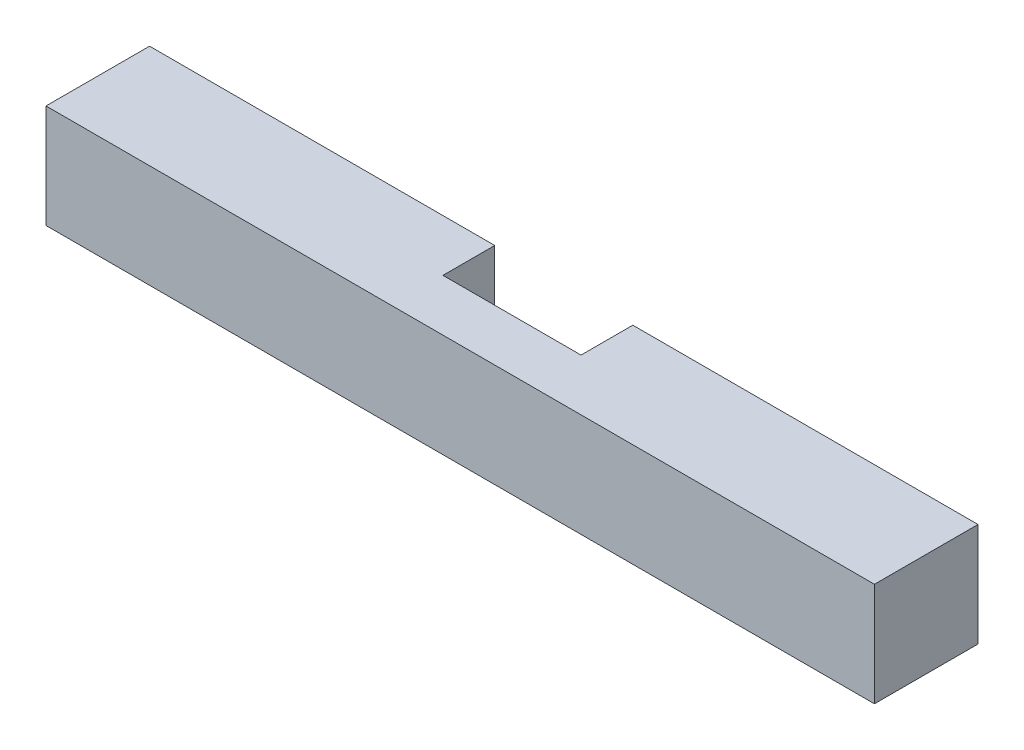
ISO-10303-21;
HEADER;
FILE_DESCRIPTION(('STEP AP214'),'2;1');
FILE_NAME('part.step','',(''),(''),'','','');
FILE_SCHEMA(('AUTOMOTIVE_DESIGN { 1 0 10303 214 1 1 1 1 }'));
ENDSEC;
DATA;
#1=APPLICATION_CONTEXT('core data for automotive mechanical design processes');
#2=APPLICATION_PROTOCOL_DEFINITION('international standard','automotive_design',2000,#1);
#3=PRODUCT_CONTEXT('',#1,'mechanical');
#4=PRODUCT('Part','Part','',(#3));
#5=PRODUCT_RELATED_PRODUCT_CATEGORY('part','',(#4));
#6=PRODUCT_DEFINITION_FORMATION('','',#4);
#7=PRODUCT_DEFINITION_CONTEXT('part definition',#1,'design');
#8=PRODUCT_DEFINITION('design','',#6,#7);
#9=PRODUCT_DEFINITION_SHAPE('','',#8);
#10=(LENGTH_UNIT() NAMED_UNIT(*) SI_UNIT(.MILLI.,.METRE.));
#11=(NAMED_UNIT(*) PLANE_ANGLE_UNIT() SI_UNIT($,.RADIAN.));
#12=(NAMED_UNIT(*) SI_UNIT($,.STERADIAN.) SOLID_ANGLE_UNIT());
#13=UNCERTAINTY_MEASURE_WITH_UNIT(LENGTH_MEASURE(1.E-05),#10,'distance_accuracy_value','');
#14=(GEOMETRIC_REPRESENTATION_CONTEXT(3) GLOBAL_UNCERTAINTY_ASSIGNED_CONTEXT((#13)) GLOBAL_UNIT_ASSIGNED_CONTEXT((#10,
#11,#12)) REPRESENTATION_CONTEXT('',''));
#15=CARTESIAN_POINT('',(0.,0.,0.));
#16=DIRECTION('',(0.,0.,1.));
#17=DIRECTION('',(1.,0.,0.));
#18=AXIS2_PLACEMENT_3D('',#15,#16,#17);
#19=CARTESIAN_POINT('',(0.,6.35,-6.35));
#20=DIRECTION('',(1.,0.,0.));
#21=DIRECTION('',(0.,0.,-1.));
#22=AXIS2_PLACEMENT_3D('',#19,#20,#21);
#23=PLANE('',#22);
#24=DIRECTION('',(0.,0.,1.));
#25=VECTOR('',#24,1.);
#26=CARTESIAN_POINT('',(0.,0.,-6.35));
#27=LINE('',#26,#25);
#28=CARTESIAN_POINT('',(0.,0.,-6.35));
#29=VERTEX_POINT('',#28);
#30=CARTESIAN_POINT('',(0.,0.,0.));
#31=VERTEX_POINT('',#30);
#32=EDGE_CURVE('E129',#29,#31,#27,.T.);
#33=ORIENTED_EDGE('',*,*,#32,.T.);
#34=DIRECTION('',(0.,-1.,0.));
#35=VECTOR('',#34,1.);
#36=CARTESIAN_POINT('',(0.,6.35,0.));
#37=LINE('',#36,#35);
#38=CARTESIAN_POINT('',(0.,6.35,0.));
#39=VERTEX_POINT('',#38);
#40=EDGE_CURVE('E11',#39,#31,#37,.T.);
#41=ORIENTED_EDGE('',*,*,#40,.F.);
#42=DIRECTION('',(0.,0.,1.));
#43=VECTOR('',#42,1.);
#44=CARTESIAN_POINT('',(0.,6.35,-6.35));
#45=LINE('',#44,#43);
#46=CARTESIAN_POINT('',(0.,6.35,-6.35));
#47=VERTEX_POINT('',#46);
#48=EDGE_CURVE('E143',#47,#39,#45,.T.);
#49=ORIENTED_EDGE('',*,*,#48,.F.);
#50=DIRECTION('',(0.,-1.,0.));
#51=VECTOR('',#50,1.);
#52=CARTESIAN_POINT('',(0.,6.35,-6.35));
#53=LINE('',#52,#51);
#54=EDGE_CURVE('E125',#47,#29,#53,.T.);
#55=ORIENTED_EDGE('',*,*,#54,.T.);
#56=EDGE_LOOP('',(#33,#41,#49,#55));
#57=FACE_BOUND('',#56,.T.);
#58=ADVANCED_FACE('F33',(#57),#23,.F.);
#59=CARTESIAN_POINT('',(0.,6.35,0.));
#60=DIRECTION('',(0.,0.,-1.));
#61=DIRECTION('',(-1.,0.,0.));
#62=AXIS2_PLACEMENT_3D('',#59,#60,#61);
#63=PLANE('',#62);
#64=DIRECTION('',(1.,0.,0.));
#65=VECTOR('',#64,1.);
#66=CARTESIAN_POINT('',(0.,0.,0.));
#67=LINE('',#66,#65);
#68=CARTESIAN_POINT('',(50.8,0.,0.));
#69=VERTEX_POINT('',#68);
#70=EDGE_CURVE('E132',#31,#69,#67,.T.);
#71=ORIENTED_EDGE('',*,*,#70,.T.);
#72=DIRECTION('',(0.,-1.,0.));
#73=VECTOR('',#72,1.);
#74=CARTESIAN_POINT('',(50.8,6.35,0.));
#75=LINE('',#74,#73);
#76=CARTESIAN_POINT('',(50.8,6.35,0.));
#77=VERTEX_POINT('',#76);
#78=EDGE_CURVE('E41',#77,#69,#75,.T.);
#79=ORIENTED_EDGE('',*,*,#78,.F.);
#80=DIRECTION('',(1.,0.,0.));
#81=VECTOR('',#80,1.);
#82=CARTESIAN_POINT('',(0.,6.35,0.));
#83=LINE('',#82,#81);
#84=EDGE_CURVE('E92',#39,#77,#83,.T.);
#85=ORIENTED_EDGE('',*,*,#84,.F.);
#86=ORIENTED_EDGE('',*,*,#40,.T.);
#87=EDGE_LOOP('',(#71,#79,#85,#86));
#88=FACE_BOUND('',#87,.T.);
#89=ADVANCED_FACE('F178',(#88),#63,.F.);
#90=CARTESIAN_POINT('',(50.8,6.35,0.));
#91=DIRECTION('',(-1.,0.,0.));
#92=DIRECTION('',(0.,0.,1.));
#93=AXIS2_PLACEMENT_3D('',#90,#91,#92);
#94=PLANE('',#93);
#95=DIRECTION('',(0.,0.,-1.));
#96=VECTOR('',#95,1.);
#97=CARTESIAN_POINT('',(50.8,0.,0.));
#98=LINE('',#97,#96);
#99=CARTESIAN_POINT('',(50.8,0.,-6.35));
#100=VERTEX_POINT('',#99);
#101=EDGE_CURVE('E134',#69,#100,#98,.T.);
#102=ORIENTED_EDGE('',*,*,#101,.T.);
#103=DIRECTION('',(0.,-1.,0.));
#104=VECTOR('',#103,1.);
#105=CARTESIAN_POINT('',(50.8,6.35,-6.35));
#106=LINE('',#105,#104);
#107=CARTESIAN_POINT('',(50.8,6.35,-6.35));
#108=VERTEX_POINT('',#107);
#109=EDGE_CURVE('E150',#108,#100,#106,.T.);
#110=ORIENTED_EDGE('',*,*,#109,.F.);
#111=DIRECTION('',(0.,0.,-1.));
#112=VECTOR('',#111,1.);
#113=CARTESIAN_POINT('',(50.8,6.35,0.));
#114=LINE('',#113,#112);
#115=EDGE_CURVE('E158',#77,#108,#114,.T.);
#116=ORIENTED_EDGE('',*,*,#115,.F.);
#117=ORIENTED_EDGE('',*,*,#78,.T.);
#118=EDGE_LOOP('',(#102,#110,#116,#117));
#119=FACE_BOUND('',#118,.T.);
#120=ADVANCED_FACE('F156',(#119),#94,.F.);
#121=CARTESIAN_POINT('',(50.8,6.35,-6.35));
#122=DIRECTION('',(0.,0.,1.));
#123=DIRECTION('',(1.,0.,0.));
#124=AXIS2_PLACEMENT_3D('',#121,#122,#123);
#125=PLANE('',#124);
#126=DIRECTION('',(-1.,0.,0.));
#127=VECTOR('',#126,1.);
#128=CARTESIAN_POINT('',(50.8,0.,-6.35));
#129=LINE('',#128,#127);
#130=CARTESIAN_POINT('',(29.6333333333333,0.,-6.35));
#131=VERTEX_POINT('',#130);
#132=EDGE_CURVE('E136',#100,#131,#129,.T.);
#133=ORIENTED_EDGE('',*,*,#132,.T.);
#134=DIRECTION('',(0.,-1.,0.));
#135=VECTOR('',#134,1.);
#136=CARTESIAN_POINT('',(29.6333333333333,6.35,-6.35));
#137=LINE('',#136,#135);
#138=CARTESIAN_POINT('',(29.6333333333333,6.35,-6.35));
#139=VERTEX_POINT('',#138);
#140=EDGE_CURVE('E147',#139,#131,#137,.T.);
#141=ORIENTED_EDGE('',*,*,#140,.F.);
#142=DIRECTION('',(-1.,0.,0.));
#143=VECTOR('',#142,1.);
#144=CARTESIAN_POINT('',(50.8,6.35,-6.35));
#145=LINE('',#144,#143);
#146=EDGE_CURVE('E170',#108,#139,#145,.T.);
#147=ORIENTED_EDGE('',*,*,#146,.F.);
#148=ORIENTED_EDGE('',*,*,#109,.T.);
#149=EDGE_LOOP('',(#133,#141,#147,#148));
#150=FACE_BOUND('',#149,.T.);
#151=ADVANCED_FACE('F166',(#150),#125,.F.);
#152=CARTESIAN_POINT('',(29.6333333333333,6.35,-6.35));
#153=DIRECTION('',(1.,0.,0.));
#154=DIRECTION('',(0.,0.,-1.));
#155=AXIS2_PLACEMENT_3D('',#152,#153,#154);
#156=PLANE('',#155);
#157=DIRECTION('',(0.,0.,1.));
#158=VECTOR('',#157,1.);
#159=CARTESIAN_POINT('',(29.6333333333333,0.,-6.35));
#160=LINE('',#159,#158);
#161=CARTESIAN_POINT('',(29.6333333333333,0.,-3.175));
#162=VERTEX_POINT('',#161);
#163=EDGE_CURVE('E138',#131,#162,#160,.T.);
#164=ORIENTED_EDGE('',*,*,#163,.T.);
#165=DIRECTION('',(0.,-1.,0.));
#166=VECTOR('',#165,1.);
#167=CARTESIAN_POINT('',(29.6333333333333,6.35,-3.175));
#168=LINE('',#167,#166);
#169=CARTESIAN_POINT('',(29.6333333333333,6.35,-3.175));
#170=VERTEX_POINT('',#169);
#171=EDGE_CURVE('E120',#170,#162,#168,.T.);
#172=ORIENTED_EDGE('',*,*,#171,.F.);
#173=DIRECTION('',(0.,0.,1.));
#174=VECTOR('',#173,1.);
#175=CARTESIAN_POINT('',(29.6333333333333,6.35,-6.35));
#176=LINE('',#175,#174);
#177=EDGE_CURVE('E111',#139,#170,#176,.T.);
#178=ORIENTED_EDGE('',*,*,#177,.F.);
#179=ORIENTED_EDGE('',*,*,#140,.T.);
#180=EDGE_LOOP('',(#164,#172,#178,#179));
#181=FACE_BOUND('',#180,.T.);
#182=ADVANCED_FACE('F169',(#181),#156,.F.);
#183=CARTESIAN_POINT('',(29.6333333333333,6.35,-3.175));
#184=DIRECTION('',(0.,0.,1.));
#185=DIRECTION('',(1.,0.,0.));
#186=AXIS2_PLACEMENT_3D('',#183,#184,#185);
#187=PLANE('',#186);
#188=DIRECTION('',(-1.,0.,0.));
#189=VECTOR('',#188,1.);
#190=CARTESIAN_POINT('',(29.6333333333333,0.,-3.175));
#191=LINE('',#190,#189);
#192=CARTESIAN_POINT('',(21.1666666666667,0.,-3.175));
#193=VERTEX_POINT('',#192);
#194=EDGE_CURVE('E119',#162,#193,#191,.T.);
#195=ORIENTED_EDGE('',*,*,#194,.T.);
#196=DIRECTION('',(0.,-1.,0.));
#197=VECTOR('',#196,1.);
#198=CARTESIAN_POINT('',(21.1666666666667,6.35,-3.175));
#199=LINE('',#198,#197);
#200=CARTESIAN_POINT('',(21.1666666666667,6.35,-3.175));
#201=VERTEX_POINT('',#200);
#202=EDGE_CURVE('E116',#201,#193,#199,.T.);
#203=ORIENTED_EDGE('',*,*,#202,.F.);
#204=DIRECTION('',(-1.,0.,0.));
#205=VECTOR('',#204,1.);
#206=CARTESIAN_POINT('',(29.6333333333333,6.35,-3.175));
#207=LINE('',#206,#205);
#208=EDGE_CURVE('E105',#170,#201,#207,.T.);
#209=ORIENTED_EDGE('',*,*,#208,.F.);
#210=ORIENTED_EDGE('',*,*,#171,.T.);
#211=EDGE_LOOP('',(#195,#203,#209,#210));
#212=FACE_BOUND('',#211,.T.);
#213=ADVANCED_FACE('F117',(#212),#187,.F.);
#214=CARTESIAN_POINT('',(21.1666666666667,6.35,-3.175));
#215=DIRECTION('',(-1.,0.,0.));
#216=DIRECTION('',(0.,0.,1.));
#217=AXIS2_PLACEMENT_3D('',#214,#215,#216);
#218=PLANE('',#217);
#219=DIRECTION('',(0.,0.,-1.));
#220=VECTOR('',#219,1.);
#221=CARTESIAN_POINT('',(21.1666666666667,0.,-3.175));
#222=LINE('',#221,#220);
#223=CARTESIAN_POINT('',(21.1666666666667,0.,-6.35));
#224=VERTEX_POINT('',#223);
#225=EDGE_CURVE('E78',#193,#224,#222,.T.);
#226=ORIENTED_EDGE('',*,*,#225,.T.);
#227=DIRECTION('',(0.,-1.,0.));
#228=VECTOR('',#227,1.);
#229=CARTESIAN_POINT('',(21.1666666666667,6.35,-6.35));
#230=LINE('',#229,#228);
#231=CARTESIAN_POINT('',(21.1666666666667,6.35,-6.35));
#232=VERTEX_POINT('',#231);
#233=EDGE_CURVE('E121',#232,#224,#230,.T.);
#234=ORIENTED_EDGE('',*,*,#233,.F.);
#235=DIRECTION('',(0.,0.,-1.));
#236=VECTOR('',#235,1.);
#237=CARTESIAN_POINT('',(21.1666666666667,6.35,-3.175));
#238=LINE('',#237,#236);
#239=EDGE_CURVE('E109',#201,#232,#238,.T.);
#240=ORIENTED_EDGE('',*,*,#239,.F.);
#241=ORIENTED_EDGE('',*,*,#202,.T.);
#242=EDGE_LOOP('',(#226,#234,#240,#241));
#243=FACE_BOUND('',#242,.T.);
#244=ADVANCED_FACE('F123',(#243),#218,.F.);
#245=CARTESIAN_POINT('',(21.1666666666667,6.35,-6.35));
#246=DIRECTION('',(0.,0.,1.));
#247=DIRECTION('',(1.,0.,0.));
#248=AXIS2_PLACEMENT_3D('',#245,#246,#247);
#249=PLANE('',#248);
#250=DIRECTION('',(-1.,0.,0.));
#251=VECTOR('',#250,1.);
#252=CARTESIAN_POINT('',(21.1666666666667,0.,-6.35));
#253=LINE('',#252,#251);
#254=EDGE_CURVE('E84',#224,#29,#253,.T.);
#255=ORIENTED_EDGE('',*,*,#254,.T.);
#256=ORIENTED_EDGE('',*,*,#54,.F.);
#257=DIRECTION('',(-1.,0.,0.));
#258=VECTOR('',#257,1.);
#259=CARTESIAN_POINT('',(21.1666666666667,6.35,-6.35));
#260=LINE('',#259,#258);
#261=EDGE_CURVE('E49',#232,#47,#260,.T.);
#262=ORIENTED_EDGE('',*,*,#261,.F.);
#263=ORIENTED_EDGE('',*,*,#233,.T.);
#264=EDGE_LOOP('',(#255,#256,#262,#263));
#265=FACE_BOUND('',#264,.T.);
#266=ADVANCED_FACE('F194',(#265),#249,.F.);
#267=CARTESIAN_POINT('',(0.,6.35,0.));
#268=DIRECTION('',(0.,1.,0.));
#269=DIRECTION('',(0.,0.,1.));
#270=AXIS2_PLACEMENT_3D('',#267,#268,#269);
#271=PLANE('',#270);
#272=ORIENTED_EDGE('',*,*,#48,.T.);
#273=ORIENTED_EDGE('',*,*,#84,.T.);
#274=ORIENTED_EDGE('',*,*,#115,.T.);
#275=ORIENTED_EDGE('',*,*,#146,.T.);
#276=ORIENTED_EDGE('',*,*,#177,.T.);
#277=ORIENTED_EDGE('',*,*,#208,.T.);
#278=ORIENTED_EDGE('',*,*,#239,.T.);
#279=ORIENTED_EDGE('',*,*,#261,.T.);
#280=EDGE_LOOP('',(#272,#273,#274,#275,#276,#277,#278,#279));
#281=FACE_BOUND('',#280,.T.);
#282=ADVANCED_FACE('F107',(#281),#271,.T.);
#283=CARTESIAN_POINT('',(0.,0.,0.));
#284=DIRECTION('',(0.,1.,0.));
#285=DIRECTION('',(0.,0.,1.));
#286=AXIS2_PLACEMENT_3D('',#283,#284,#285);
#287=PLANE('',#286);
#288=ORIENTED_EDGE('',*,*,#32,.F.);
#289=ORIENTED_EDGE('',*,*,#254,.F.);
#290=ORIENTED_EDGE('',*,*,#225,.F.);
#291=ORIENTED_EDGE('',*,*,#194,.F.);
#292=ORIENTED_EDGE('',*,*,#163,.F.);
#293=ORIENTED_EDGE('',*,*,#132,.F.);
#294=ORIENTED_EDGE('',*,*,#101,.F.);
#295=ORIENTED_EDGE('',*,*,#70,.F.);
#296=EDGE_LOOP('',(#288,#289,#290,#291,#292,#293,#294,#295));
#297=FACE_BOUND('',#296,.T.);
#298=ADVANCED_FACE('F162',(#297),#287,.F.);
#299=CLOSED_SHELL('',(#58,#89,#120,#151,#182,#213,#244,#266,#282,#298));
#300=MANIFOLD_SOLID_BREP('B2',#299);
#301=ADVANCED_BREP_SHAPE_REPRESENTATION('',(#18,#300),#14);
#302=SHAPE_DEFINITION_REPRESENTATION(#9,#301);
ENDSEC;
END-ISO-10303-21;
